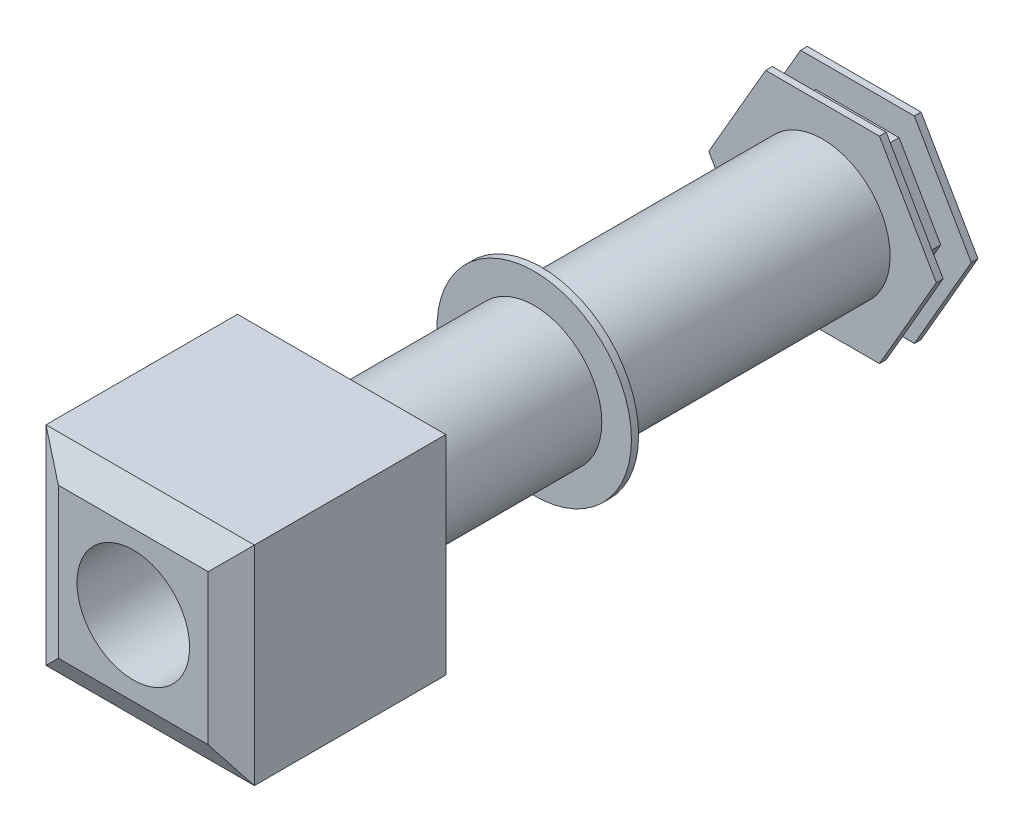
ISO-10303-21;
HEADER;
FILE_DESCRIPTION(('STEP AP214'),'2;1');
FILE_NAME('part.step','',(''),(''),'','','');
FILE_SCHEMA(('AUTOMOTIVE_DESIGN { 1 0 10303 214 1 1 1 1 }'));
ENDSEC;
DATA;
#1=APPLICATION_CONTEXT('core data for automotive mechanical design processes');
#2=APPLICATION_PROTOCOL_DEFINITION('international standard','automotive_design',2000,#1);
#3=PRODUCT_CONTEXT('',#1,'mechanical');
#4=PRODUCT('Part','Part','',(#3));
#5=PRODUCT_RELATED_PRODUCT_CATEGORY('part','',(#4));
#6=PRODUCT_DEFINITION_FORMATION('','',#4);
#7=PRODUCT_DEFINITION_CONTEXT('part definition',#1,'design');
#8=PRODUCT_DEFINITION('design','',#6,#7);
#9=PRODUCT_DEFINITION_SHAPE('','',#8);
#10=(LENGTH_UNIT() NAMED_UNIT(*) SI_UNIT(.MILLI.,.METRE.));
#11=(NAMED_UNIT(*) PLANE_ANGLE_UNIT() SI_UNIT($,.RADIAN.));
#12=(NAMED_UNIT(*) SI_UNIT($,.STERADIAN.) SOLID_ANGLE_UNIT());
#13=UNCERTAINTY_MEASURE_WITH_UNIT(LENGTH_MEASURE(1.E-05),#10,'distance_accuracy_value','');
#14=(GEOMETRIC_REPRESENTATION_CONTEXT(3) GLOBAL_UNCERTAINTY_ASSIGNED_CONTEXT((#13)) GLOBAL_UNIT_ASSIGNED_CONTEXT((#10,
#11,#12)) REPRESENTATION_CONTEXT('',''));
#15=CARTESIAN_POINT('',(0.,0.,0.));
#16=DIRECTION('',(0.,0.,1.));
#17=DIRECTION('',(1.,0.,0.));
#18=AXIS2_PLACEMENT_3D('',#15,#16,#17);
#19=CARTESIAN_POINT('',(101.036297108185,-175.,12.));
#20=DIRECTION('',(-0.866025403784439,0.5,0.));
#21=DIRECTION('',(-0.5,-0.866025403784439,0.));
#22=AXIS2_PLACEMENT_3D('',#19,#20,#21);
#23=PLANE('',#22);
#24=DIRECTION('',(0.5,0.866025403784439,0.));
#25=VECTOR('',#24,1.);
#26=CARTESIAN_POINT('',(101.036297108185,-175.,0.));
#27=LINE('',#26,#25);
#28=CARTESIAN_POINT('',(101.036297108185,-175.,0.));
#29=VERTEX_POINT('',#28);
#30=CARTESIAN_POINT('',(202.072594216369,0.,0.));
#31=VERTEX_POINT('',#30);
#32=EDGE_CURVE('E409',#29,#31,#27,.T.);
#33=ORIENTED_EDGE('',*,*,#32,.T.);
#34=DIRECTION('',(0.,0.,-1.));
#35=VECTOR('',#34,1.);
#36=CARTESIAN_POINT('',(202.072594216369,0.,12.));
#37=LINE('',#36,#35);
#38=CARTESIAN_POINT('',(202.072594216369,0.,12.));
#39=VERTEX_POINT('',#38);
#40=EDGE_CURVE('E275',#39,#31,#37,.T.);
#41=ORIENTED_EDGE('',*,*,#40,.F.);
#42=DIRECTION('',(0.5,0.866025403784439,0.));
#43=VECTOR('',#42,1.);
#44=CARTESIAN_POINT('',(101.036297108185,-175.,12.));
#45=LINE('',#44,#43);
#46=CARTESIAN_POINT('',(101.036297108185,-175.,12.));
#47=VERTEX_POINT('',#46);
#48=EDGE_CURVE('E410',#47,#39,#45,.T.);
#49=ORIENTED_EDGE('',*,*,#48,.F.);
#50=DIRECTION('',(0.,0.,-1.));
#51=VECTOR('',#50,1.);
#52=CARTESIAN_POINT('',(101.036297108185,-175.,12.));
#53=LINE('',#52,#51);
#54=EDGE_CURVE('E430',#47,#29,#53,.T.);
#55=ORIENTED_EDGE('',*,*,#54,.T.);
#56=EDGE_LOOP('',(#33,#41,#49,#55));
#57=FACE_BOUND('',#56,.T.);
#58=ADVANCED_FACE('F41',(#57),#23,.F.);
#59=CARTESIAN_POINT('',(202.072594216369,0.,12.));
#60=DIRECTION('',(-0.866025403784439,-0.5,0.));
#61=DIRECTION('',(0.5,-0.866025403784439,0.));
#62=AXIS2_PLACEMENT_3D('',#59,#60,#61);
#63=PLANE('',#62);
#64=DIRECTION('',(-0.5,0.866025403784439,0.));
#65=VECTOR('',#64,1.);
#66=CARTESIAN_POINT('',(202.072594216369,0.,0.));
#67=LINE('',#66,#65);
#68=CARTESIAN_POINT('',(101.036297108185,175.,0.));
#69=VERTEX_POINT('',#68);
#70=EDGE_CURVE('E434',#31,#69,#67,.T.);
#71=ORIENTED_EDGE('',*,*,#70,.T.);
#72=DIRECTION('',(0.,0.,-1.));
#73=VECTOR('',#72,1.);
#74=CARTESIAN_POINT('',(101.036297108185,175.,12.));
#75=LINE('',#74,#73);
#76=CARTESIAN_POINT('',(101.036297108185,175.,12.));
#77=VERTEX_POINT('',#76);
#78=EDGE_CURVE('E463',#77,#69,#75,.T.);
#79=ORIENTED_EDGE('',*,*,#78,.F.);
#80=DIRECTION('',(-0.5,0.866025403784439,0.));
#81=VECTOR('',#80,1.);
#82=CARTESIAN_POINT('',(202.072594216369,0.,12.));
#83=LINE('',#82,#81);
#84=EDGE_CURVE('E414',#39,#77,#83,.T.);
#85=ORIENTED_EDGE('',*,*,#84,.F.);
#86=ORIENTED_EDGE('',*,*,#40,.T.);
#87=EDGE_LOOP('',(#71,#79,#85,#86));
#88=FACE_BOUND('',#87,.T.);
#89=ADVANCED_FACE('F540',(#88),#63,.F.);
#90=CARTESIAN_POINT('',(101.036297108185,175.,12.));
#91=DIRECTION('',(0.,-1.,0.));
#92=DIRECTION('',(1.,0.,0.));
#93=AXIS2_PLACEMENT_3D('',#90,#91,#92);
#94=PLANE('',#93);
#95=DIRECTION('',(-1.,0.,0.));
#96=VECTOR('',#95,1.);
#97=CARTESIAN_POINT('',(101.036297108185,175.,0.));
#98=LINE('',#97,#96);
#99=CARTESIAN_POINT('',(-101.036297108185,175.,0.));
#100=VERTEX_POINT('',#99);
#101=EDGE_CURVE('E437',#69,#100,#98,.T.);
#102=ORIENTED_EDGE('',*,*,#101,.T.);
#103=DIRECTION('',(0.,0.,-1.));
#104=VECTOR('',#103,1.);
#105=CARTESIAN_POINT('',(-101.036297108185,175.,12.));
#106=LINE('',#105,#104);
#107=CARTESIAN_POINT('',(-101.036297108185,175.,12.));
#108=VERTEX_POINT('',#107);
#109=EDGE_CURVE('E459',#108,#100,#106,.T.);
#110=ORIENTED_EDGE('',*,*,#109,.F.);
#111=DIRECTION('',(-1.,0.,0.));
#112=VECTOR('',#111,1.);
#113=CARTESIAN_POINT('',(101.036297108185,175.,12.));
#114=LINE('',#113,#112);
#115=EDGE_CURVE('E418',#77,#108,#114,.T.);
#116=ORIENTED_EDGE('',*,*,#115,.F.);
#117=ORIENTED_EDGE('',*,*,#78,.T.);
#118=EDGE_LOOP('',(#102,#110,#116,#117));
#119=FACE_BOUND('',#118,.T.);
#120=ADVANCED_FACE('F546',(#119),#94,.F.);
#121=CARTESIAN_POINT('',(-101.036297108185,175.,12.));
#122=DIRECTION('',(0.866025403784439,-0.5,0.));
#123=DIRECTION('',(0.5,0.866025403784439,0.));
#124=AXIS2_PLACEMENT_3D('',#121,#122,#123);
#125=PLANE('',#124);
#126=DIRECTION('',(-0.5,-0.866025403784439,0.));
#127=VECTOR('',#126,1.);
#128=CARTESIAN_POINT('',(-101.036297108185,175.,0.));
#129=LINE('',#128,#127);
#130=CARTESIAN_POINT('',(-202.072594216369,0.,0.));
#131=VERTEX_POINT('',#130);
#132=EDGE_CURVE('E440',#100,#131,#129,.T.);
#133=ORIENTED_EDGE('',*,*,#132,.T.);
#134=DIRECTION('',(0.,0.,-1.));
#135=VECTOR('',#134,1.);
#136=CARTESIAN_POINT('',(-202.072594216369,0.,12.));
#137=LINE('',#136,#135);
#138=CARTESIAN_POINT('',(-202.072594216369,0.,12.));
#139=VERTEX_POINT('',#138);
#140=EDGE_CURVE('E455',#139,#131,#137,.T.);
#141=ORIENTED_EDGE('',*,*,#140,.F.);
#142=DIRECTION('',(-0.5,-0.866025403784439,0.));
#143=VECTOR('',#142,1.);
#144=CARTESIAN_POINT('',(-101.036297108185,175.,12.));
#145=LINE('',#144,#143);
#146=EDGE_CURVE('E421',#108,#139,#145,.T.);
#147=ORIENTED_EDGE('',*,*,#146,.F.);
#148=ORIENTED_EDGE('',*,*,#109,.T.);
#149=EDGE_LOOP('',(#133,#141,#147,#148));
#150=FACE_BOUND('',#149,.T.);
#151=ADVANCED_FACE('F700',(#150),#125,.F.);
#152=CARTESIAN_POINT('',(-202.072594216369,0.,12.));
#153=DIRECTION('',(0.866025403784439,0.5,0.));
#154=DIRECTION('',(-0.5,0.866025403784439,0.));
#155=AXIS2_PLACEMENT_3D('',#152,#153,#154);
#156=PLANE('',#155);
#157=DIRECTION('',(0.5,-0.866025403784439,0.));
#158=VECTOR('',#157,1.);
#159=CARTESIAN_POINT('',(-202.072594216369,0.,0.));
#160=LINE('',#159,#158);
#161=CARTESIAN_POINT('',(-101.036297108185,-175.,0.));
#162=VERTEX_POINT('',#161);
#163=EDGE_CURVE('E443',#131,#162,#160,.T.);
#164=ORIENTED_EDGE('',*,*,#163,.T.);
#165=DIRECTION('',(0.,0.,-1.));
#166=VECTOR('',#165,1.);
#167=CARTESIAN_POINT('',(-101.036297108185,-175.,12.));
#168=LINE('',#167,#166);
#169=CARTESIAN_POINT('',(-101.036297108185,-175.,12.));
#170=VERTEX_POINT('',#169);
#171=EDGE_CURVE('E451',#170,#162,#168,.T.);
#172=ORIENTED_EDGE('',*,*,#171,.F.);
#173=DIRECTION('',(0.5,-0.866025403784439,0.));
#174=VECTOR('',#173,1.);
#175=CARTESIAN_POINT('',(-202.072594216369,0.,12.));
#176=LINE('',#175,#174);
#177=EDGE_CURVE('E424',#139,#170,#176,.T.);
#178=ORIENTED_EDGE('',*,*,#177,.F.);
#179=ORIENTED_EDGE('',*,*,#140,.T.);
#180=EDGE_LOOP('',(#164,#172,#178,#179));
#181=FACE_BOUND('',#180,.T.);
#182=ADVANCED_FACE('F696',(#181),#156,.F.);
#183=CARTESIAN_POINT('',(-101.036297108185,-175.,12.));
#184=DIRECTION('',(0.,1.,0.));
#185=DIRECTION('',(0.,0.,1.));
#186=AXIS2_PLACEMENT_3D('',#183,#184,#185);
#187=PLANE('',#186);
#188=DIRECTION('',(1.,0.,0.));
#189=VECTOR('',#188,1.);
#190=CARTESIAN_POINT('',(-101.036297108185,-175.,0.));
#191=LINE('',#190,#189);
#192=EDGE_CURVE('E415',#162,#29,#191,.T.);
#193=ORIENTED_EDGE('',*,*,#192,.T.);
#194=ORIENTED_EDGE('',*,*,#54,.F.);
#195=DIRECTION('',(1.,0.,0.));
#196=VECTOR('',#195,1.);
#197=CARTESIAN_POINT('',(-101.036297108185,-175.,12.));
#198=LINE('',#197,#196);
#199=EDGE_CURVE('E427',#170,#47,#198,.T.);
#200=ORIENTED_EDGE('',*,*,#199,.F.);
#201=ORIENTED_EDGE('',*,*,#171,.T.);
#202=EDGE_LOOP('',(#193,#194,#200,#201));
#203=FACE_BOUND('',#202,.T.);
#204=ADVANCED_FACE('F689',(#203),#187,.F.);
#205=CARTESIAN_POINT('',(0.,0.,12.));
#206=DIRECTION('',(0.,0.,1.));
#207=DIRECTION('',(1.,0.,0.));
#208=AXIS2_PLACEMENT_3D('',#205,#206,#207);
#209=PLANE('',#208);
#210=DIRECTION('',(0.499999999999995,0.866025403784441,0.));
#211=VECTOR('',#210,1.);
#212=CARTESIAN_POINT('',(73.9437494106932,-128.074330881458,12.));
#213=LINE('',#212,#211);
#214=CARTESIAN_POINT('',(73.9437494106932,-128.074330881458,12.));
#215=VERTEX_POINT('',#214);
#216=CARTESIAN_POINT('',(147.887498821383,0.,12.));
#217=VERTEX_POINT('',#216);
#218=EDGE_CURVE('E337',#215,#217,#213,.T.);
#219=ORIENTED_EDGE('',*,*,#218,.F.);
#220=DIRECTION('',(1.,0.,0.));
#221=VECTOR('',#220,1.);
#222=CARTESIAN_POINT('',(-73.9437494106905,-128.07433088146,12.));
#223=LINE('',#222,#221);
#224=CARTESIAN_POINT('',(-73.9437494106905,-128.07433088146,12.));
#225=VERTEX_POINT('',#224);
#226=EDGE_CURVE('E343',#225,#215,#223,.T.);
#227=ORIENTED_EDGE('',*,*,#226,.F.);
#228=DIRECTION('',(0.500000000000007,-0.866025403784435,0.));
#229=VECTOR('',#228,1.);
#230=CARTESIAN_POINT('',(-147.887498821383,-1.03269288476609E-12,12.));
#231=LINE('',#230,#229);
#232=CARTESIAN_POINT('',(-147.887498821383,-1.03269288476609E-12,12.));
#233=VERTEX_POINT('',#232);
#234=EDGE_CURVE('E379',#233,#225,#231,.T.);
#235=ORIENTED_EDGE('',*,*,#234,.F.);
#236=DIRECTION('',(-0.499999999999995,-0.866025403784442,0.));
#237=VECTOR('',#236,1.);
#238=CARTESIAN_POINT('',(-73.9437494106923,128.074330881459,12.));
#239=LINE('',#238,#237);
#240=CARTESIAN_POINT('',(-73.9437494106923,128.074330881459,12.));
#241=VERTEX_POINT('',#240);
#242=EDGE_CURVE('E375',#241,#233,#239,.T.);
#243=ORIENTED_EDGE('',*,*,#242,.F.);
#244=DIRECTION('',(-1.,0.,0.));
#245=VECTOR('',#244,1.);
#246=CARTESIAN_POINT('',(73.9437494106914,128.074330881459,12.));
#247=LINE('',#246,#245);
#248=CARTESIAN_POINT('',(73.9437494106914,128.074330881459,12.));
#249=VERTEX_POINT('',#248);
#250=EDGE_CURVE('E371',#249,#241,#247,.T.);
#251=ORIENTED_EDGE('',*,*,#250,.F.);
#252=DIRECTION('',(-0.500000000000001,0.866025403784438,0.));
#253=VECTOR('',#252,1.);
#254=CARTESIAN_POINT('',(147.887498821383,0.,12.));
#255=LINE('',#254,#253);
#256=EDGE_CURVE('E367',#217,#249,#255,.T.);
#257=ORIENTED_EDGE('',*,*,#256,.F.);
#258=EDGE_LOOP('',(#219,#227,#235,#243,#251,#257));
#259=FACE_BOUND('',#258,.T.);
#260=ORIENTED_EDGE('',*,*,#48,.T.);
#261=ORIENTED_EDGE('',*,*,#84,.T.);
#262=ORIENTED_EDGE('',*,*,#115,.T.);
#263=ORIENTED_EDGE('',*,*,#146,.T.);
#264=ORIENTED_EDGE('',*,*,#177,.T.);
#265=ORIENTED_EDGE('',*,*,#199,.T.);
#266=EDGE_LOOP('',(#260,#261,#262,#263,#264,#265));
#267=FACE_BOUND('',#266,.T.);
#268=ADVANCED_FACE('F686',(#259,#267),#209,.T.);
#269=CARTESIAN_POINT('',(0.,0.,0.));
#270=DIRECTION('',(0.,0.,1.));
#271=DIRECTION('',(1.,0.,0.));
#272=AXIS2_PLACEMENT_3D('',#269,#270,#271);
#273=PLANE('',#272);
#274=ORIENTED_EDGE('',*,*,#32,.F.);
#275=ORIENTED_EDGE('',*,*,#192,.F.);
#276=ORIENTED_EDGE('',*,*,#163,.F.);
#277=ORIENTED_EDGE('',*,*,#132,.F.);
#278=ORIENTED_EDGE('',*,*,#101,.F.);
#279=ORIENTED_EDGE('',*,*,#70,.F.);
#280=EDGE_LOOP('',(#274,#275,#276,#277,#278,#279));
#281=FACE_BOUND('',#280,.T.);
#282=ADVANCED_FACE('F684',(#281),#273,.F.);
#283=CARTESIAN_POINT('',(73.9437494106932,-128.074330881458,62.));
#284=DIRECTION('',(-0.866025403784442,0.499999999999995,0.));
#285=DIRECTION('',(-0.499999999999995,-0.866025403784442,0.));
#286=AXIS2_PLACEMENT_3D('',#283,#284,#285);
#287=PLANE('',#286);
#288=ORIENTED_EDGE('',*,*,#218,.T.);
#289=DIRECTION('',(0.,0.,-1.));
#290=VECTOR('',#289,1.);
#291=CARTESIAN_POINT('',(147.887498821383,0.,62.));
#292=LINE('',#291,#290);
#293=CARTESIAN_POINT('',(147.887498821383,0.,62.));
#294=VERTEX_POINT('',#293);
#295=EDGE_CURVE('E405',#294,#217,#292,.T.);
#296=ORIENTED_EDGE('',*,*,#295,.F.);
#297=DIRECTION('',(0.499999999999995,0.866025403784441,0.));
#298=VECTOR('',#297,1.);
#299=CARTESIAN_POINT('',(73.9437494106932,-128.074330881458,62.));
#300=LINE('',#299,#298);
#301=CARTESIAN_POINT('',(73.9437494106932,-128.074330881458,62.));
#302=VERTEX_POINT('',#301);
#303=EDGE_CURVE('E338',#302,#294,#300,.T.);
#304=ORIENTED_EDGE('',*,*,#303,.F.);
#305=DIRECTION('',(0.,0.,-1.));
#306=VECTOR('',#305,1.);
#307=CARTESIAN_POINT('',(73.9437494106932,-128.074330881458,62.));
#308=LINE('',#307,#306);
#309=EDGE_CURVE('E363',#302,#215,#308,.T.);
#310=ORIENTED_EDGE('',*,*,#309,.T.);
#311=EDGE_LOOP('',(#288,#296,#304,#310));
#312=FACE_BOUND('',#311,.T.);
#313=ADVANCED_FACE('F680',(#312),#287,.F.);
#314=CARTESIAN_POINT('',(147.887498821383,0.,62.));
#315=DIRECTION('',(-0.866025403784438,-0.500000000000001,0.));
#316=DIRECTION('',(0.500000000000001,-0.866025403784438,0.));
#317=AXIS2_PLACEMENT_3D('',#314,#315,#316);
#318=PLANE('',#317);
#319=ORIENTED_EDGE('',*,*,#256,.T.);
#320=DIRECTION('',(0.,0.,-1.));
#321=VECTOR('',#320,1.);
#322=CARTESIAN_POINT('',(73.9437494106914,128.074330881459,62.));
#323=LINE('',#322,#321);
#324=CARTESIAN_POINT('',(73.9437494106914,128.074330881459,62.));
#325=VERTEX_POINT('',#324);
#326=EDGE_CURVE('E401',#325,#249,#323,.T.);
#327=ORIENTED_EDGE('',*,*,#326,.F.);
#328=DIRECTION('',(-0.500000000000001,0.866025403784438,0.));
#329=VECTOR('',#328,1.);
#330=CARTESIAN_POINT('',(147.887498821383,0.,62.));
#331=LINE('',#330,#329);
#332=EDGE_CURVE('E342',#294,#325,#331,.T.);
#333=ORIENTED_EDGE('',*,*,#332,.F.);
#334=ORIENTED_EDGE('',*,*,#295,.T.);
#335=EDGE_LOOP('',(#319,#327,#333,#334));
#336=FACE_BOUND('',#335,.T.);
#337=ADVANCED_FACE('F676',(#336),#318,.F.);
#338=CARTESIAN_POINT('',(73.9437494106914,128.074330881459,62.));
#339=DIRECTION('',(0.,-1.,0.));
#340=DIRECTION('',(1.,0.,0.));
#341=AXIS2_PLACEMENT_3D('',#338,#339,#340);
#342=PLANE('',#341);
#343=ORIENTED_EDGE('',*,*,#250,.T.);
#344=DIRECTION('',(0.,0.,-1.));
#345=VECTOR('',#344,1.);
#346=CARTESIAN_POINT('',(-73.9437494106923,128.074330881459,62.));
#347=LINE('',#346,#345);
#348=CARTESIAN_POINT('',(-73.9437494106923,128.074330881459,62.));
#349=VERTEX_POINT('',#348);
#350=EDGE_CURVE('E397',#349,#241,#347,.T.);
#351=ORIENTED_EDGE('',*,*,#350,.F.);
#352=DIRECTION('',(-1.,0.,0.));
#353=VECTOR('',#352,1.);
#354=CARTESIAN_POINT('',(73.9437494106914,128.074330881459,62.));
#355=LINE('',#354,#353);
#356=EDGE_CURVE('E347',#325,#349,#355,.T.);
#357=ORIENTED_EDGE('',*,*,#356,.F.);
#358=ORIENTED_EDGE('',*,*,#326,.T.);
#359=EDGE_LOOP('',(#343,#351,#357,#358));
#360=FACE_BOUND('',#359,.T.);
#361=ADVANCED_FACE('F672',(#360),#342,.F.);
#362=CARTESIAN_POINT('',(-73.9437494106923,128.074330881459,62.));
#363=DIRECTION('',(0.866025403784442,-0.499999999999995,0.));
#364=DIRECTION('',(0.499999999999995,0.866025403784442,0.));
#365=AXIS2_PLACEMENT_3D('',#362,#363,#364);
#366=PLANE('',#365);
#367=ORIENTED_EDGE('',*,*,#242,.T.);
#368=DIRECTION('',(0.,0.,-1.));
#369=VECTOR('',#368,1.);
#370=CARTESIAN_POINT('',(-147.887498821383,-1.03269288476609E-12,62.));
#371=LINE('',#370,#369);
#372=CARTESIAN_POINT('',(-147.887498821383,-1.03269288476609E-12,62.));
#373=VERTEX_POINT('',#372);
#374=EDGE_CURVE('E393',#373,#233,#371,.T.);
#375=ORIENTED_EDGE('',*,*,#374,.F.);
#376=DIRECTION('',(-0.499999999999995,-0.866025403784442,0.));
#377=VECTOR('',#376,1.);
#378=CARTESIAN_POINT('',(-73.9437494106923,128.074330881459,62.));
#379=LINE('',#378,#377);
#380=EDGE_CURVE('E351',#349,#373,#379,.T.);
#381=ORIENTED_EDGE('',*,*,#380,.F.);
#382=ORIENTED_EDGE('',*,*,#350,.T.);
#383=EDGE_LOOP('',(#367,#375,#381,#382));
#384=FACE_BOUND('',#383,.T.);
#385=ADVANCED_FACE('F668',(#384),#366,.F.);
#386=CARTESIAN_POINT('',(-147.887498821383,-1.03269288476609E-12,62.));
#387=DIRECTION('',(0.866025403784435,0.500000000000007,0.));
#388=DIRECTION('',(-0.500000000000007,0.866025403784435,0.));
#389=AXIS2_PLACEMENT_3D('',#386,#387,#388);
#390=PLANE('',#389);
#391=ORIENTED_EDGE('',*,*,#234,.T.);
#392=DIRECTION('',(0.,0.,-1.));
#393=VECTOR('',#392,1.);
#394=CARTESIAN_POINT('',(-73.9437494106905,-128.07433088146,62.));
#395=LINE('',#394,#393);
#396=CARTESIAN_POINT('',(-73.9437494106905,-128.07433088146,62.));
#397=VERTEX_POINT('',#396);
#398=EDGE_CURVE('E389',#397,#225,#395,.T.);
#399=ORIENTED_EDGE('',*,*,#398,.F.);
#400=DIRECTION('',(0.500000000000007,-0.866025403784435,0.));
#401=VECTOR('',#400,1.);
#402=CARTESIAN_POINT('',(-147.887498821383,-1.03269288476609E-12,62.));
#403=LINE('',#402,#401);
#404=EDGE_CURVE('E355',#373,#397,#403,.T.);
#405=ORIENTED_EDGE('',*,*,#404,.F.);
#406=ORIENTED_EDGE('',*,*,#374,.T.);
#407=EDGE_LOOP('',(#391,#399,#405,#406));
#408=FACE_BOUND('',#407,.T.);
#409=ADVANCED_FACE('F664',(#408),#390,.F.);
#410=CARTESIAN_POINT('',(-73.9437494106905,-128.07433088146,62.));
#411=DIRECTION('',(0.,1.,0.));
#412=DIRECTION('',(-1.,0.,0.));
#413=AXIS2_PLACEMENT_3D('',#410,#411,#412);
#414=PLANE('',#413);
#415=ORIENTED_EDGE('',*,*,#226,.T.);
#416=ORIENTED_EDGE('',*,*,#309,.F.);
#417=DIRECTION('',(1.,0.,0.));
#418=VECTOR('',#417,1.);
#419=CARTESIAN_POINT('',(-73.9437494106905,-128.07433088146,62.));
#420=LINE('',#419,#418);
#421=EDGE_CURVE('E359',#397,#302,#420,.T.);
#422=ORIENTED_EDGE('',*,*,#421,.F.);
#423=ORIENTED_EDGE('',*,*,#398,.T.);
#424=EDGE_LOOP('',(#415,#416,#422,#423));
#425=FACE_BOUND('',#424,.T.);
#426=ADVANCED_FACE('F638',(#425),#414,.F.);
#427=CARTESIAN_POINT('',(0.,0.,62.));
#428=DIRECTION('',(0.,0.,1.));
#429=DIRECTION('',(1.,0.,0.));
#430=AXIS2_PLACEMENT_3D('',#427,#428,#429);
#431=PLANE('',#430);
#432=DIRECTION('',(0.499999999999995,0.866025403784442,0.));
#433=VECTOR('',#432,1.);
#434=CARTESIAN_POINT('',(101.036297108187,-174.999999999999,62.));
#435=LINE('',#434,#433);
#436=CARTESIAN_POINT('',(101.036297108187,-174.999999999999,62.));
#437=VERTEX_POINT('',#436);
#438=CARTESIAN_POINT('',(202.072594216369,0.,62.));
#439=VERTEX_POINT('',#438);
#440=EDGE_CURVE('E269',#437,#439,#435,.T.);
#441=ORIENTED_EDGE('',*,*,#440,.F.);
#442=DIRECTION('',(1.,0.,0.));
#443=VECTOR('',#442,1.);
#444=CARTESIAN_POINT('',(-101.036297108183,-175.000000000001,62.));
#445=LINE('',#444,#443);
#446=CARTESIAN_POINT('',(-101.036297108183,-175.000000000001,62.));
#447=VERTEX_POINT('',#446);
#448=EDGE_CURVE('E281',#447,#437,#445,.T.);
#449=ORIENTED_EDGE('',*,*,#448,.F.);
#450=DIRECTION('',(0.500000000000007,-0.866025403784435,0.));
#451=VECTOR('',#450,1.);
#452=CARTESIAN_POINT('',(-202.072594216369,-1.41106538359615E-12,62.));
#453=LINE('',#452,#451);
#454=CARTESIAN_POINT('',(-202.072594216369,-1.41106538359615E-12,62.));
#455=VERTEX_POINT('',#454);
#456=EDGE_CURVE('E309',#455,#447,#453,.T.);
#457=ORIENTED_EDGE('',*,*,#456,.F.);
#458=DIRECTION('',(-0.499999999999995,-0.866025403784442,0.));
#459=VECTOR('',#458,1.);
#460=CARTESIAN_POINT('',(-101.036297108185,175.,62.));
#461=LINE('',#460,#459);
#462=CARTESIAN_POINT('',(-101.036297108185,175.,62.));
#463=VERTEX_POINT('',#462);
#464=EDGE_CURVE('E306',#463,#455,#461,.T.);
#465=ORIENTED_EDGE('',*,*,#464,.F.);
#466=DIRECTION('',(-1.,0.,0.));
#467=VECTOR('',#466,1.);
#468=CARTESIAN_POINT('',(101.036297108184,175.,62.));
#469=LINE('',#468,#467);
#470=CARTESIAN_POINT('',(101.036297108184,175.,62.));
#471=VERTEX_POINT('',#470);
#472=EDGE_CURVE('E303',#471,#463,#469,.T.);
#473=ORIENTED_EDGE('',*,*,#472,.F.);
#474=DIRECTION('',(-0.500000000000001,0.866025403784438,0.));
#475=VECTOR('',#474,1.);
#476=CARTESIAN_POINT('',(202.072594216369,0.,62.));
#477=LINE('',#476,#475);
#478=EDGE_CURVE('E300',#439,#471,#477,.T.);
#479=ORIENTED_EDGE('',*,*,#478,.F.);
#480=EDGE_LOOP('',(#441,#449,#457,#465,#473,#479));
#481=FACE_BOUND('',#480,.T.);
#482=ORIENTED_EDGE('',*,*,#421,.T.);
#483=ORIENTED_EDGE('',*,*,#303,.T.);
#484=ORIENTED_EDGE('',*,*,#332,.T.);
#485=ORIENTED_EDGE('',*,*,#356,.T.);
#486=ORIENTED_EDGE('',*,*,#380,.T.);
#487=ORIENTED_EDGE('',*,*,#404,.T.);
#488=EDGE_LOOP('',(#482,#483,#484,#485,#486,#487));
#489=FACE_BOUND('',#488,.T.);
#490=ADVANCED_FACE('F634',(#481,#489),#431,.F.);
#491=CARTESIAN_POINT('',(101.036297108187,-174.999999999999,74.));
#492=DIRECTION('',(-0.866025403784441,0.499999999999995,0.));
#493=DIRECTION('',(-0.499999999999995,-0.866025403784442,0.));
#494=AXIS2_PLACEMENT_3D('',#491,#492,#493);
#495=PLANE('',#494);
#496=ORIENTED_EDGE('',*,*,#440,.T.);
#497=DIRECTION('',(0.,0.,-1.));
#498=VECTOR('',#497,1.);
#499=CARTESIAN_POINT('',(202.072594216369,0.,74.));
#500=LINE('',#499,#498);
#501=CARTESIAN_POINT('',(202.072594216369,0.,74.));
#502=VERTEX_POINT('',#501);
#503=EDGE_CURVE('E333',#502,#439,#500,.T.);
#504=ORIENTED_EDGE('',*,*,#503,.F.);
#505=DIRECTION('',(0.499999999999995,0.866025403784442,0.));
#506=VECTOR('',#505,1.);
#507=CARTESIAN_POINT('',(101.036297108187,-174.999999999999,74.));
#508=LINE('',#507,#506);
#509=CARTESIAN_POINT('',(101.036297108187,-174.999999999999,74.));
#510=VERTEX_POINT('',#509);
#511=EDGE_CURVE('E276',#510,#502,#508,.T.);
#512=ORIENTED_EDGE('',*,*,#511,.F.);
#513=DIRECTION('',(0.,0.,-1.));
#514=VECTOR('',#513,1.);
#515=CARTESIAN_POINT('',(101.036297108187,-174.999999999999,74.));
#516=LINE('',#515,#514);
#517=EDGE_CURVE('E296',#510,#437,#516,.T.);
#518=ORIENTED_EDGE('',*,*,#517,.T.);
#519=EDGE_LOOP('',(#496,#504,#512,#518));
#520=FACE_BOUND('',#519,.T.);
#521=ADVANCED_FACE('F637',(#520),#495,.F.);
#522=CARTESIAN_POINT('',(202.072594216369,0.,74.));
#523=DIRECTION('',(-0.866025403784438,-0.500000000000001,0.));
#524=DIRECTION('',(0.500000000000001,-0.866025403784438,0.));
#525=AXIS2_PLACEMENT_3D('',#522,#523,#524);
#526=PLANE('',#525);
#527=ORIENTED_EDGE('',*,*,#478,.T.);
#528=DIRECTION('',(0.,0.,-1.));
#529=VECTOR('',#528,1.);
#530=CARTESIAN_POINT('',(101.036297108184,175.,74.));
#531=LINE('',#530,#529);
#532=CARTESIAN_POINT('',(101.036297108184,175.,74.));
#533=VERTEX_POINT('',#532);
#534=EDGE_CURVE('E329',#533,#471,#531,.T.);
#535=ORIENTED_EDGE('',*,*,#534,.F.);
#536=DIRECTION('',(-0.500000000000001,0.866025403784438,0.));
#537=VECTOR('',#536,1.);
#538=CARTESIAN_POINT('',(202.072594216369,0.,74.));
#539=LINE('',#538,#537);
#540=EDGE_CURVE('E280',#502,#533,#539,.T.);
#541=ORIENTED_EDGE('',*,*,#540,.F.);
#542=ORIENTED_EDGE('',*,*,#503,.T.);
#543=EDGE_LOOP('',(#527,#535,#541,#542));
#544=FACE_BOUND('',#543,.T.);
#545=ADVANCED_FACE('F654',(#544),#526,.F.);
#546=CARTESIAN_POINT('',(101.036297108184,175.,74.));
#547=DIRECTION('',(0.,-1.,0.));
#548=DIRECTION('',(1.,0.,0.));
#549=AXIS2_PLACEMENT_3D('',#546,#547,#548);
#550=PLANE('',#549);
#551=ORIENTED_EDGE('',*,*,#472,.T.);
#552=DIRECTION('',(0.,0.,-1.));
#553=VECTOR('',#552,1.);
#554=CARTESIAN_POINT('',(-101.036297108185,175.,74.));
#555=LINE('',#554,#553);
#556=CARTESIAN_POINT('',(-101.036297108185,175.,74.));
#557=VERTEX_POINT('',#556);
#558=EDGE_CURVE('E325',#557,#463,#555,.T.);
#559=ORIENTED_EDGE('',*,*,#558,.F.);
#560=DIRECTION('',(-1.,0.,0.));
#561=VECTOR('',#560,1.);
#562=CARTESIAN_POINT('',(101.036297108184,175.,74.));
#563=LINE('',#562,#561);
#564=EDGE_CURVE('E284',#533,#557,#563,.T.);
#565=ORIENTED_EDGE('',*,*,#564,.F.);
#566=ORIENTED_EDGE('',*,*,#534,.T.);
#567=EDGE_LOOP('',(#551,#559,#565,#566));
#568=FACE_BOUND('',#567,.T.);
#569=ADVANCED_FACE('F650',(#568),#550,.F.);
#570=CARTESIAN_POINT('',(-101.036297108185,175.,74.));
#571=DIRECTION('',(0.866025403784441,-0.499999999999995,0.));
#572=DIRECTION('',(0.499999999999995,0.866025403784442,0.));
#573=AXIS2_PLACEMENT_3D('',#570,#571,#572);
#574=PLANE('',#573);
#575=ORIENTED_EDGE('',*,*,#464,.T.);
#576=DIRECTION('',(0.,0.,-1.));
#577=VECTOR('',#576,1.);
#578=CARTESIAN_POINT('',(-202.072594216369,-1.41106538359615E-12,74.));
#579=LINE('',#578,#577);
#580=CARTESIAN_POINT('',(-202.072594216369,-1.41106538359615E-12,74.));
#581=VERTEX_POINT('',#580);
#582=EDGE_CURVE('E321',#581,#455,#579,.T.);
#583=ORIENTED_EDGE('',*,*,#582,.F.);
#584=DIRECTION('',(-0.499999999999995,-0.866025403784442,0.));
#585=VECTOR('',#584,1.);
#586=CARTESIAN_POINT('',(-101.036297108185,175.,74.));
#587=LINE('',#586,#585);
#588=EDGE_CURVE('E287',#557,#581,#587,.T.);
#589=ORIENTED_EDGE('',*,*,#588,.F.);
#590=ORIENTED_EDGE('',*,*,#558,.T.);
#591=EDGE_LOOP('',(#575,#583,#589,#590));
#592=FACE_BOUND('',#591,.T.);
#593=ADVANCED_FACE('F646',(#592),#574,.F.);
#594=CARTESIAN_POINT('',(-202.072594216369,-1.41106538359615E-12,74.));
#595=DIRECTION('',(0.866025403784435,0.500000000000007,0.));
#596=DIRECTION('',(-0.500000000000007,0.866025403784434,0.));
#597=AXIS2_PLACEMENT_3D('',#594,#595,#596);
#598=PLANE('',#597);
#599=ORIENTED_EDGE('',*,*,#456,.T.);
#600=DIRECTION('',(0.,0.,-1.));
#601=VECTOR('',#600,1.);
#602=CARTESIAN_POINT('',(-101.036297108183,-175.000000000001,74.));
#603=LINE('',#602,#601);
#604=CARTESIAN_POINT('',(-101.036297108183,-175.000000000001,74.));
#605=VERTEX_POINT('',#604);
#606=EDGE_CURVE('E317',#605,#447,#603,.T.);
#607=ORIENTED_EDGE('',*,*,#606,.F.);
#608=DIRECTION('',(0.500000000000007,-0.866025403784435,0.));
#609=VECTOR('',#608,1.);
#610=CARTESIAN_POINT('',(-202.072594216369,-1.41106538359615E-12,74.));
#611=LINE('',#610,#609);
#612=EDGE_CURVE('E290',#581,#605,#611,.T.);
#613=ORIENTED_EDGE('',*,*,#612,.F.);
#614=ORIENTED_EDGE('',*,*,#582,.T.);
#615=EDGE_LOOP('',(#599,#607,#613,#614));
#616=FACE_BOUND('',#615,.T.);
#617=ADVANCED_FACE('F642',(#616),#598,.F.);
#618=CARTESIAN_POINT('',(-101.036297108183,-175.000000000001,74.));
#619=DIRECTION('',(0.,1.,0.));
#620=DIRECTION('',(-1.,0.,0.));
#621=AXIS2_PLACEMENT_3D('',#618,#619,#620);
#622=PLANE('',#621);
#623=ORIENTED_EDGE('',*,*,#448,.T.);
#624=ORIENTED_EDGE('',*,*,#517,.F.);
#625=DIRECTION('',(1.,0.,0.));
#626=VECTOR('',#625,1.);
#627=CARTESIAN_POINT('',(-101.036297108183,-175.000000000001,74.));
#628=LINE('',#627,#626);
#629=EDGE_CURVE('E293',#605,#510,#628,.T.);
#630=ORIENTED_EDGE('',*,*,#629,.F.);
#631=ORIENTED_EDGE('',*,*,#606,.T.);
#632=EDGE_LOOP('',(#623,#624,#630,#631));
#633=FACE_BOUND('',#632,.T.);
#634=ADVANCED_FACE('F632',(#633),#622,.F.);
#635=CARTESIAN_POINT('',(0.,0.,74.));
#636=DIRECTION('',(0.,0.,1.));
#637=DIRECTION('',(1.,0.,0.));
#638=AXIS2_PLACEMENT_3D('',#635,#636,#637);
#639=PLANE('',#638);
#640=CARTESIAN_POINT('',(0.,0.,74.));
#641=DIRECTION('',(0.,0.,1.));
#642=DIRECTION('',(1.,0.,0.));
#643=AXIS2_PLACEMENT_3D('',#640,#641,#642);
#644=CIRCLE('',#643,120.);
#645=CARTESIAN_POINT('',(120.,0.,74.));
#646=VERTEX_POINT('',#645);
#647=EDGE_CURVE('E270',#646,#646,#644,.T.);
#648=ORIENTED_EDGE('',*,*,#647,.F.);
#649=EDGE_LOOP('',(#648));
#650=FACE_BOUND('',#649,.T.);
#651=ORIENTED_EDGE('',*,*,#511,.T.);
#652=ORIENTED_EDGE('',*,*,#540,.T.);
#653=ORIENTED_EDGE('',*,*,#564,.T.);
#654=ORIENTED_EDGE('',*,*,#588,.T.);
#655=ORIENTED_EDGE('',*,*,#612,.T.);
#656=ORIENTED_EDGE('',*,*,#629,.T.);
#657=EDGE_LOOP('',(#651,#652,#653,#654,#655,#656));
#658=FACE_BOUND('',#657,.T.);
#659=ADVANCED_FACE('F628',(#650,#658),#639,.T.);
#660=CARTESIAN_POINT('',(0.,0.,574.));
#661=DIRECTION('',(0.,0.,-1.));
#662=DIRECTION('',(-1.,0.,0.));
#663=AXIS2_PLACEMENT_3D('',#660,#661,#662);
#664=CYLINDRICAL_SURFACE('',#663,120.);
#665=CARTESIAN_POINT('',(0.,0.,564.));
#666=DIRECTION('',(0.,0.,1.));
#667=DIRECTION('',(1.,0.,0.));
#668=AXIS2_PLACEMENT_3D('',#665,#666,#667);
#669=CIRCLE('',#668,120.);
#670=CARTESIAN_POINT('',(120.,0.,564.));
#671=VERTEX_POINT('',#670);
#672=EDGE_CURVE('E274',#671,#671,#669,.F.);
#673=ORIENTED_EDGE('',*,*,#672,.T.);
#674=EDGE_LOOP('',(#673));
#675=FACE_BOUND('',#674,.T.);
#676=ORIENTED_EDGE('',*,*,#647,.T.);
#677=EDGE_LOOP('',(#676));
#678=FACE_BOUND('',#677,.T.);
#679=ADVANCED_FACE('F624',(#675,#678),#664,.T.);
#680=CARTESIAN_POINT('',(0.,0.,586.));
#681=DIRECTION('',(0.,0.,-1.));
#682=DIRECTION('',(-1.,0.,0.));
#683=AXIS2_PLACEMENT_3D('',#680,#681,#682);
#684=CYLINDRICAL_SURFACE('',#683,172.646944325416);
#685=CARTESIAN_POINT('',(0.,0.,573.283076736427));
#686=DIRECTION('',(0.,0.,1.));
#687=DIRECTION('',(1.,0.,0.));
#688=AXIS2_PLACEMENT_3D('',#685,#686,#687);
#689=CIRCLE('',#688,172.646944325416);
#690=CARTESIAN_POINT('',(172.646944325416,0.,573.283076736427));
#691=VERTEX_POINT('',#690);
#692=EDGE_CURVE('E265',#691,#691,#689,.T.);
#693=ORIENTED_EDGE('',*,*,#692,.T.);
#694=EDGE_LOOP('',(#693));
#695=FACE_BOUND('',#694,.T.);
#696=CARTESIAN_POINT('',(0.,0.,586.));
#697=DIRECTION('',(0.,0.,1.));
#698=DIRECTION('',(1.,0.,0.));
#699=AXIS2_PLACEMENT_3D('',#696,#697,#698);
#700=CIRCLE('',#699,172.646944325416);
#701=CARTESIAN_POINT('',(172.646944325416,0.,586.));
#702=VERTEX_POINT('',#701);
#703=EDGE_CURVE('E256',#702,#702,#700,.T.);
#704=ORIENTED_EDGE('',*,*,#703,.F.);
#705=EDGE_LOOP('',(#704));
#706=FACE_BOUND('',#705,.T.);
#707=ADVANCED_FACE('F620',(#695,#706),#684,.T.);
#708=CARTESIAN_POINT('',(0.,0.,586.));
#709=DIRECTION('',(0.,0.,1.));
#710=DIRECTION('',(1.,0.,0.));
#711=AXIS2_PLACEMENT_3D('',#708,#709,#710);
#712=PLANE('',#711);
#713=CARTESIAN_POINT('',(0.,0.,586.));
#714=DIRECTION('',(0.,0.,1.));
#715=DIRECTION('',(1.,0.,0.));
#716=AXIS2_PLACEMENT_3D('',#713,#714,#715);
#717=CIRCLE('',#716,120.);
#718=CARTESIAN_POINT('',(120.,0.,586.));
#719=VERTEX_POINT('',#718);
#720=EDGE_CURVE('E260',#719,#719,#717,.T.);
#721=ORIENTED_EDGE('',*,*,#720,.F.);
#722=EDGE_LOOP('',(#721));
#723=FACE_BOUND('',#722,.T.);
#724=ORIENTED_EDGE('',*,*,#703,.T.);
#725=EDGE_LOOP('',(#724));
#726=FACE_BOUND('',#725,.T.);
#727=ADVANCED_FACE('F559',(#723,#726),#712,.T.);
#728=CARTESIAN_POINT('',(0.,0.,574.));
#729=DIRECTION('',(0.,0.,1.));
#730=DIRECTION('',(1.,0.,0.));
#731=AXIS2_PLACEMENT_3D('',#728,#729,#730);
#732=CONICAL_SURFACE('',#731,176.71281819618,1.39626340159547);
#733=ORIENTED_EDGE('',*,*,#672,.F.);
#734=EDGE_LOOP('',(#733));
#735=FACE_BOUND('',#734,.T.);
#736=ORIENTED_EDGE('',*,*,#692,.F.);
#737=EDGE_LOOP('',(#736));
#738=FACE_BOUND('',#737,.T.);
#739=ADVANCED_FACE('F552',(#735,#738),#732,.T.);
#740=CARTESIAN_POINT('',(0.,0.,916.));
#741=DIRECTION('',(0.,0.,-1.));
#742=DIRECTION('',(-1.,0.,0.));
#743=AXIS2_PLACEMENT_3D('',#740,#741,#742);
#744=CYLINDRICAL_SURFACE('',#743,120.);
#745=CARTESIAN_POINT('',(0.,0.,910.));
#746=DIRECTION('',(0.,0.,1.));
#747=DIRECTION('',(1.,0.,0.));
#748=AXIS2_PLACEMENT_3D('',#745,#746,#747);
#749=CIRCLE('',#748,120.);
#750=CARTESIAN_POINT('',(120.,0.,910.));
#751=VERTEX_POINT('',#750);
#752=EDGE_CURVE('E479',#751,#751,#749,.F.);
#753=ORIENTED_EDGE('',*,*,#752,.T.);
#754=EDGE_LOOP('',(#753));
#755=FACE_BOUND('',#754,.T.);
#756=ORIENTED_EDGE('',*,*,#720,.T.);
#757=EDGE_LOOP('',(#756));
#758=FACE_BOUND('',#757,.T.);
#759=ADVANCED_FACE('F558',(#755,#758),#744,.T.);
#760=CARTESIAN_POINT('',(0.,0.,928.));
#761=DIRECTION('',(0.,0.,-1.));
#762=DIRECTION('',(-1.,0.,0.));
#763=AXIS2_PLACEMENT_3D('',#760,#761,#762);
#764=CYLINDRICAL_SURFACE('',#763,172.646944325416);
#765=CARTESIAN_POINT('',(0.,0.,928.));
#766=DIRECTION('',(0.,0.,1.));
#767=DIRECTION('',(1.,0.,0.));
#768=AXIS2_PLACEMENT_3D('',#765,#766,#767);
#769=CIRCLE('',#768,172.646944325416);
#770=CARTESIAN_POINT('',(172.646944325416,0.,928.));
#771=VERTEX_POINT('',#770);
#772=EDGE_CURVE('E252',#771,#771,#769,.T.);
#773=ORIENTED_EDGE('',*,*,#772,.F.);
#774=EDGE_LOOP('',(#773));
#775=FACE_BOUND('',#774,.T.);
#776=CARTESIAN_POINT('',(0.,0.,916.));
#777=DIRECTION('',(0.,0.,1.));
#778=DIRECTION('',(1.,0.,0.));
#779=AXIS2_PLACEMENT_3D('',#776,#777,#778);
#780=CIRCLE('',#779,172.646944325416);
#781=CARTESIAN_POINT('',(172.646944325416,0.,916.));
#782=VERTEX_POINT('',#781);
#783=EDGE_CURVE('E216',#782,#782,#780,.T.);
#784=ORIENTED_EDGE('',*,*,#783,.T.);
#785=EDGE_LOOP('',(#784));
#786=FACE_BOUND('',#785,.T.);
#787=ADVANCED_FACE('F610',(#775,#786),#764,.T.);
#788=CARTESIAN_POINT('',(0.,0.,916.));
#789=DIRECTION('',(0.,0.,1.));
#790=DIRECTION('',(1.,0.,0.));
#791=AXIS2_PLACEMENT_3D('',#788,#789,#790);
#792=PLANE('',#791);
#793=CARTESIAN_POINT('',(0.,0.,916.));
#794=DIRECTION('',(0.,0.,1.));
#795=DIRECTION('',(1.,0.,0.));
#796=AXIS2_PLACEMENT_3D('',#793,#794,#795);
#797=CIRCLE('',#796,136.484864516728);
#798=CARTESIAN_POINT('',(136.484864516728,0.,916.));
#799=VERTEX_POINT('',#798);
#800=EDGE_CURVE('E264',#799,#799,#797,.T.);
#801=ORIENTED_EDGE('',*,*,#800,.T.);
#802=EDGE_LOOP('',(#801));
#803=FACE_BOUND('',#802,.T.);
#804=ORIENTED_EDGE('',*,*,#783,.F.);
#805=EDGE_LOOP('',(#804));
#806=FACE_BOUND('',#805,.T.);
#807=ADVANCED_FACE('F566',(#803,#806),#792,.F.);
#808=CARTESIAN_POINT('',(0.,0.,916.));
#809=DIRECTION('',(0.,0.,1.));
#810=DIRECTION('',(1.,0.,0.));
#811=AXIS2_PLACEMENT_3D('',#808,#809,#810);
#812=CONICAL_SURFACE('',#811,136.484864516728,1.22173047639604);
#813=ORIENTED_EDGE('',*,*,#752,.F.);
#814=EDGE_LOOP('',(#813));
#815=FACE_BOUND('',#814,.T.);
#816=ORIENTED_EDGE('',*,*,#800,.F.);
#817=EDGE_LOOP('',(#816));
#818=FACE_BOUND('',#817,.T.);
#819=ADVANCED_FACE('F561',(#815,#818),#812,.T.);
#820=CARTESIAN_POINT('',(185.,185.,1298.));
#821=DIRECTION('',(-1.,0.,0.));
#822=DIRECTION('',(0.,-1.,0.));
#823=AXIS2_PLACEMENT_3D('',#820,#821,#822);
#824=PLANE('',#823);
#825=DIRECTION('',(0.,0.,-1.));
#826=VECTOR('',#825,1.);
#827=CARTESIAN_POINT('',(185.,185.,1298.));
#828=LINE('',#827,#826);
#829=CARTESIAN_POINT('',(185.,185.,1268.));
#830=VERTEX_POINT('',#829);
#831=CARTESIAN_POINT('',(185.,185.,928.));
#832=VERTEX_POINT('',#831);
#833=EDGE_CURVE('E205',#830,#832,#828,.T.);
#834=ORIENTED_EDGE('',*,*,#833,.F.);
#835=DIRECTION('',(0.,-1.,0.));
#836=VECTOR('',#835,1.);
#837=CARTESIAN_POINT('',(185.,-185.,1268.));
#838=LINE('',#837,#836);
#839=CARTESIAN_POINT('',(185.,-185.,1268.));
#840=VERTEX_POINT('',#839);
#841=EDGE_CURVE('E496',#830,#840,#838,.T.);
#842=ORIENTED_EDGE('',*,*,#841,.T.);
#843=DIRECTION('',(0.,0.,-1.));
#844=VECTOR('',#843,1.);
#845=CARTESIAN_POINT('',(185.,-185.,1298.));
#846=LINE('',#845,#844);
#847=CARTESIAN_POINT('',(185.,-185.,928.));
#848=VERTEX_POINT('',#847);
#849=EDGE_CURVE('E229',#840,#848,#846,.T.);
#850=ORIENTED_EDGE('',*,*,#849,.T.);
#851=DIRECTION('',(0.,1.,0.));
#852=VECTOR('',#851,1.);
#853=CARTESIAN_POINT('',(185.,185.,928.));
#854=LINE('',#853,#852);
#855=EDGE_CURVE('E223',#848,#832,#854,.T.);
#856=ORIENTED_EDGE('',*,*,#855,.T.);
#857=EDGE_LOOP('',(#834,#842,#850,#856));
#858=FACE_BOUND('',#857,.T.);
#859=ADVANCED_FACE('F228',(#858),#824,.F.);
#860=CARTESIAN_POINT('',(-185.,185.,1298.));
#861=DIRECTION('',(0.,-1.,0.));
#862=DIRECTION('',(0.,0.,-1.));
#863=AXIS2_PLACEMENT_3D('',#860,#861,#862);
#864=PLANE('',#863);
#865=DIRECTION('',(0.,0.,-1.));
#866=VECTOR('',#865,1.);
#867=CARTESIAN_POINT('',(-185.,185.,1298.));
#868=LINE('',#867,#866);
#869=CARTESIAN_POINT('',(-185.,185.,1268.));
#870=VERTEX_POINT('',#869);
#871=CARTESIAN_POINT('',(-185.,185.,928.));
#872=VERTEX_POINT('',#871);
#873=EDGE_CURVE('E217',#870,#872,#868,.T.);
#874=ORIENTED_EDGE('',*,*,#873,.F.);
#875=DIRECTION('',(1.,0.,0.));
#876=VECTOR('',#875,1.);
#877=CARTESIAN_POINT('',(185.,185.,1268.));
#878=LINE('',#877,#876);
#879=EDGE_CURVE('E11',#870,#830,#878,.T.);
#880=ORIENTED_EDGE('',*,*,#879,.T.);
#881=ORIENTED_EDGE('',*,*,#833,.T.);
#882=DIRECTION('',(-1.,0.,0.));
#883=VECTOR('',#882,1.);
#884=CARTESIAN_POINT('',(-185.,185.,928.));
#885=LINE('',#884,#883);
#886=EDGE_CURVE('E208',#832,#872,#885,.T.);
#887=ORIENTED_EDGE('',*,*,#886,.T.);
#888=EDGE_LOOP('',(#874,#880,#881,#887));
#889=FACE_BOUND('',#888,.T.);
#890=ADVANCED_FACE('F207',(#889),#864,.F.);
#891=CARTESIAN_POINT('',(-185.,185.,1298.));
#892=DIRECTION('',(1.,0.,0.));
#893=DIRECTION('',(0.,1.,0.));
#894=AXIS2_PLACEMENT_3D('',#891,#892,#893);
#895=PLANE('',#894);
#896=DIRECTION('',(0.,0.,-1.));
#897=VECTOR('',#896,1.);
#898=CARTESIAN_POINT('',(-185.,-185.,1298.));
#899=LINE('',#898,#897);
#900=CARTESIAN_POINT('',(-185.,-185.,1268.));
#901=VERTEX_POINT('',#900);
#902=CARTESIAN_POINT('',(-185.,-185.,928.));
#903=VERTEX_POINT('',#902);
#904=EDGE_CURVE('E247',#901,#903,#899,.T.);
#905=ORIENTED_EDGE('',*,*,#904,.F.);
#906=DIRECTION('',(0.,1.,0.));
#907=VECTOR('',#906,1.);
#908=CARTESIAN_POINT('',(-185.,185.,1268.));
#909=LINE('',#908,#907);
#910=EDGE_CURVE('E52',#901,#870,#909,.T.);
#911=ORIENTED_EDGE('',*,*,#910,.T.);
#912=ORIENTED_EDGE('',*,*,#873,.T.);
#913=DIRECTION('',(0.,-1.,0.));
#914=VECTOR('',#913,1.);
#915=CARTESIAN_POINT('',(-185.,185.,928.));
#916=LINE('',#915,#914);
#917=EDGE_CURVE('E225',#872,#903,#916,.T.);
#918=ORIENTED_EDGE('',*,*,#917,.T.);
#919=EDGE_LOOP('',(#905,#911,#912,#918));
#920=FACE_BOUND('',#919,.T.);
#921=ADVANCED_FACE('F536',(#920),#895,.F.);
#922=CARTESIAN_POINT('',(-185.,-185.,1298.));
#923=DIRECTION('',(0.,1.,0.));
#924=DIRECTION('',(0.,0.,1.));
#925=AXIS2_PLACEMENT_3D('',#922,#923,#924);
#926=PLANE('',#925);
#927=ORIENTED_EDGE('',*,*,#849,.F.);
#928=DIRECTION('',(-1.,0.,0.));
#929=VECTOR('',#928,1.);
#930=CARTESIAN_POINT('',(-185.,-185.,1268.));
#931=LINE('',#930,#929);
#932=EDGE_CURVE('E67',#840,#901,#931,.T.);
#933=ORIENTED_EDGE('',*,*,#932,.T.);
#934=ORIENTED_EDGE('',*,*,#904,.T.);
#935=DIRECTION('',(1.,0.,0.));
#936=VECTOR('',#935,1.);
#937=CARTESIAN_POINT('',(-185.,-185.,928.));
#938=LINE('',#937,#936);
#939=EDGE_CURVE('E242',#903,#848,#938,.T.);
#940=ORIENTED_EDGE('',*,*,#939,.T.);
#941=EDGE_LOOP('',(#927,#933,#934,#940));
#942=FACE_BOUND('',#941,.T.);
#943=ADVANCED_FACE('F527',(#942),#926,.F.);
#944=CARTESIAN_POINT('',(0.,0.,1298.));
#945=DIRECTION('',(0.,0.,1.));
#946=DIRECTION('',(1.,0.,0.));
#947=AXIS2_PLACEMENT_3D('',#944,#945,#946);
#948=PLANE('',#947);
#949=DIRECTION('',(1.,0.,0.));
#950=VECTOR('',#949,1.);
#951=CARTESIAN_POINT('',(185.,-133.038475772934,1298.));
#952=LINE('',#951,#950);
#953=CARTESIAN_POINT('',(-133.038475772934,-133.038475772934,1298.));
#954=VERTEX_POINT('',#953);
#955=CARTESIAN_POINT('',(133.038475772934,-133.038475772934,1298.));
#956=VERTEX_POINT('',#955);
#957=EDGE_CURVE('E489',#954,#956,#952,.T.);
#958=ORIENTED_EDGE('',*,*,#957,.T.);
#959=DIRECTION('',(0.,1.,0.));
#960=VECTOR('',#959,1.);
#961=CARTESIAN_POINT('',(133.038475772934,185.,1298.));
#962=LINE('',#961,#960);
#963=CARTESIAN_POINT('',(133.038475772934,133.038475772934,1298.));
#964=VERTEX_POINT('',#963);
#965=EDGE_CURVE('E492',#956,#964,#962,.T.);
#966=ORIENTED_EDGE('',*,*,#965,.T.);
#967=DIRECTION('',(-1.,0.,0.));
#968=VECTOR('',#967,1.);
#969=CARTESIAN_POINT('',(-185.,133.038475772934,1298.));
#970=LINE('',#969,#968);
#971=CARTESIAN_POINT('',(-133.038475772934,133.038475772934,1298.));
#972=VERTEX_POINT('',#971);
#973=EDGE_CURVE('E483',#964,#972,#970,.T.);
#974=ORIENTED_EDGE('',*,*,#973,.T.);
#975=DIRECTION('',(0.,-1.,0.));
#976=VECTOR('',#975,1.);
#977=CARTESIAN_POINT('',(-133.038475772934,-185.,1298.));
#978=LINE('',#977,#976);
#979=EDGE_CURVE('E486',#972,#954,#978,.T.);
#980=ORIENTED_EDGE('',*,*,#979,.T.);
#981=EDGE_LOOP('',(#958,#966,#974,#980));
#982=FACE_BOUND('',#981,.T.);
#983=CARTESIAN_POINT('',(0.,0.,1298.));
#984=DIRECTION('',(0.,0.,1.));
#985=DIRECTION('',(1.,0.,0.));
#986=AXIS2_PLACEMENT_3D('',#983,#984,#985);
#987=CIRCLE('',#986,100.);
#988=CARTESIAN_POINT('',(100.,0.,1298.));
#989=VERTEX_POINT('',#988);
#990=EDGE_CURVE('E236',#989,#989,#987,.T.);
#991=ORIENTED_EDGE('',*,*,#990,.F.);
#992=EDGE_LOOP('',(#991));
#993=FACE_BOUND('',#992,.T.);
#994=ADVANCED_FACE('F525',(#982,#993),#948,.T.);
#995=CARTESIAN_POINT('',(0.,0.,928.));
#996=DIRECTION('',(0.,0.,1.));
#997=DIRECTION('',(1.,0.,0.));
#998=AXIS2_PLACEMENT_3D('',#995,#996,#997);
#999=PLANE('',#998);
#1000=ORIENTED_EDGE('',*,*,#772,.T.);
#1001=EDGE_LOOP('',(#1000));
#1002=FACE_BOUND('',#1001,.T.);
#1003=ORIENTED_EDGE('',*,*,#855,.F.);
#1004=ORIENTED_EDGE('',*,*,#939,.F.);
#1005=ORIENTED_EDGE('',*,*,#917,.F.);
#1006=ORIENTED_EDGE('',*,*,#886,.F.);
#1007=EDGE_LOOP('',(#1003,#1004,#1005,#1006));
#1008=FACE_BOUND('',#1007,.T.);
#1009=ADVANCED_FACE('F221',(#1002,#1008),#999,.F.);
#1010=CARTESIAN_POINT('',(0.,0.,398.));
#1011=DIRECTION('',(0.,0.,1.));
#1012=DIRECTION('',(1.,0.,0.));
#1013=AXIS2_PLACEMENT_3D('',#1010,#1011,#1012);
#1014=CYLINDRICAL_SURFACE('',#1013,100.);
#1015=CARTESIAN_POINT('',(0.,0.,398.));
#1016=DIRECTION('',(0.,0.,1.));
#1017=DIRECTION('',(1.,0.,0.));
#1018=AXIS2_PLACEMENT_3D('',#1015,#1016,#1017);
#1019=CIRCLE('',#1018,100.);
#1020=CARTESIAN_POINT('',(100.,0.,398.));
#1021=VERTEX_POINT('',#1020);
#1022=EDGE_CURVE('E232',#1021,#1021,#1019,.T.);
#1023=ORIENTED_EDGE('',*,*,#1022,.F.);
#1024=EDGE_LOOP('',(#1023));
#1025=FACE_BOUND('',#1024,.T.);
#1026=ORIENTED_EDGE('',*,*,#990,.T.);
#1027=EDGE_LOOP('',(#1026));
#1028=FACE_BOUND('',#1027,.T.);
#1029=ADVANCED_FACE('F523',(#1025,#1028),#1014,.F.);
#1030=CARTESIAN_POINT('',(0.,0.,398.));
#1031=DIRECTION('',(0.,0.,1.));
#1032=DIRECTION('',(1.,0.,0.));
#1033=AXIS2_PLACEMENT_3D('',#1030,#1031,#1032);
#1034=PLANE('',#1033);
#1035=ORIENTED_EDGE('',*,*,#1022,.T.);
#1036=EDGE_LOOP('',(#1035));
#1037=FACE_BOUND('',#1036,.T.);
#1038=ADVANCED_FACE('F588',(#1037),#1034,.T.);
#1039=CARTESIAN_POINT('',(-133.038475772934,0.,1298.));
#1040=DIRECTION('',(-0.500000000000003,0.,0.866025403784437));
#1041=DIRECTION('',(0.,1.,0.));
#1042=AXIS2_PLACEMENT_3D('',#1039,#1040,#1041);
#1043=PLANE('',#1042);
#1044=DIRECTION('',(0.654653670707977,-0.654653670707976,0.37796447300923));
#1045=VECTOR('',#1044,1.);
#1046=CARTESIAN_POINT('',(-76.0219861559622,76.0219861559622,1330.91848562861));
#1047=LINE('',#1046,#1045);
#1048=EDGE_CURVE('E508',#870,#972,#1047,.T.);
#1049=ORIENTED_EDGE('',*,*,#1048,.F.);
#1050=ORIENTED_EDGE('',*,*,#910,.F.);
#1051=DIRECTION('',(0.654653670707976,0.654653670707977,0.37796447300923));
#1052=VECTOR('',#1051,1.);
#1053=CARTESIAN_POINT('',(-76.0219861559622,-76.0219861559622,1330.91848562861));
#1054=LINE('',#1053,#1052);
#1055=EDGE_CURVE('E46',#954,#901,#1054,.F.);
#1056=ORIENTED_EDGE('',*,*,#1055,.F.);
#1057=ORIENTED_EDGE('',*,*,#979,.F.);
#1058=EDGE_LOOP('',(#1049,#1050,#1056,#1057));
#1059=FACE_BOUND('',#1058,.T.);
#1060=ADVANCED_FACE('F44',(#1059),#1043,.T.);
#1061=CARTESIAN_POINT('',(0.,-133.038475772934,1298.));
#1062=DIRECTION('',(0.,-0.500000000000003,0.866025403784437));
#1063=DIRECTION('',(-1.,0.,0.));
#1064=AXIS2_PLACEMENT_3D('',#1061,#1062,#1063);
#1065=PLANE('',#1064);
#1066=ORIENTED_EDGE('',*,*,#1055,.T.);
#1067=ORIENTED_EDGE('',*,*,#932,.F.);
#1068=DIRECTION('',(-0.654653670707977,0.654653670707976,0.37796447300923));
#1069=VECTOR('',#1068,1.);
#1070=CARTESIAN_POINT('',(76.0219861559622,-76.0219861559622,1330.91848562861));
#1071=LINE('',#1070,#1069);
#1072=EDGE_CURVE('E506',#956,#840,#1071,.F.);
#1073=ORIENTED_EDGE('',*,*,#1072,.F.);
#1074=ORIENTED_EDGE('',*,*,#957,.F.);
#1075=EDGE_LOOP('',(#1066,#1067,#1073,#1074));
#1076=FACE_BOUND('',#1075,.T.);
#1077=ADVANCED_FACE('F581',(#1076),#1065,.T.);
#1078=CARTESIAN_POINT('',(0.,133.038475772934,1298.));
#1079=DIRECTION('',(0.,0.500000000000003,0.866025403784437));
#1080=DIRECTION('',(1.,0.,0.));
#1081=AXIS2_PLACEMENT_3D('',#1078,#1079,#1080);
#1082=PLANE('',#1081);
#1083=ORIENTED_EDGE('',*,*,#1048,.T.);
#1084=ORIENTED_EDGE('',*,*,#973,.F.);
#1085=DIRECTION('',(0.654653670707976,0.654653670707977,-0.37796447300923));
#1086=VECTOR('',#1085,1.);
#1087=CARTESIAN_POINT('',(76.0219861559622,76.0219861559622,1330.91848562861));
#1088=LINE('',#1087,#1086);
#1089=EDGE_CURVE('E503',#830,#964,#1088,.F.);
#1090=ORIENTED_EDGE('',*,*,#1089,.F.);
#1091=ORIENTED_EDGE('',*,*,#879,.F.);
#1092=EDGE_LOOP('',(#1083,#1084,#1090,#1091));
#1093=FACE_BOUND('',#1092,.T.);
#1094=ADVANCED_FACE('F575',(#1093),#1082,.T.);
#1095=CARTESIAN_POINT('',(133.038475772934,0.,1298.));
#1096=DIRECTION('',(0.500000000000003,0.,0.866025403784437));
#1097=DIRECTION('',(0.,-1.,0.));
#1098=AXIS2_PLACEMENT_3D('',#1095,#1096,#1097);
#1099=PLANE('',#1098);
#1100=ORIENTED_EDGE('',*,*,#1072,.T.);
#1101=ORIENTED_EDGE('',*,*,#841,.F.);
#1102=ORIENTED_EDGE('',*,*,#1089,.T.);
#1103=ORIENTED_EDGE('',*,*,#965,.F.);
#1104=EDGE_LOOP('',(#1100,#1101,#1102,#1103));
#1105=FACE_BOUND('',#1104,.T.);
#1106=ADVANCED_FACE('F569',(#1105),#1099,.T.);
#1107=CLOSED_SHELL('',(#58,#89,#120,#151,#182,#204,#268,#282,#313,#337,#361,#385,#409,#426,#490,
#521,#545,#569,#593,#617,#634,#659,#679,#707,#727,#739,#759,#787,#807,#819,#859,#890,#921,#943,
#994,#1009,#1029,#1038,#1060,#1077,#1094,#1106));
#1108=MANIFOLD_SOLID_BREP('B2',#1107);
#1109=ADVANCED_BREP_SHAPE_REPRESENTATION('',(#18,#1108),#14);
#1110=SHAPE_DEFINITION_REPRESENTATION(#9,#1109);
ENDSEC;
END-ISO-10303-21;
